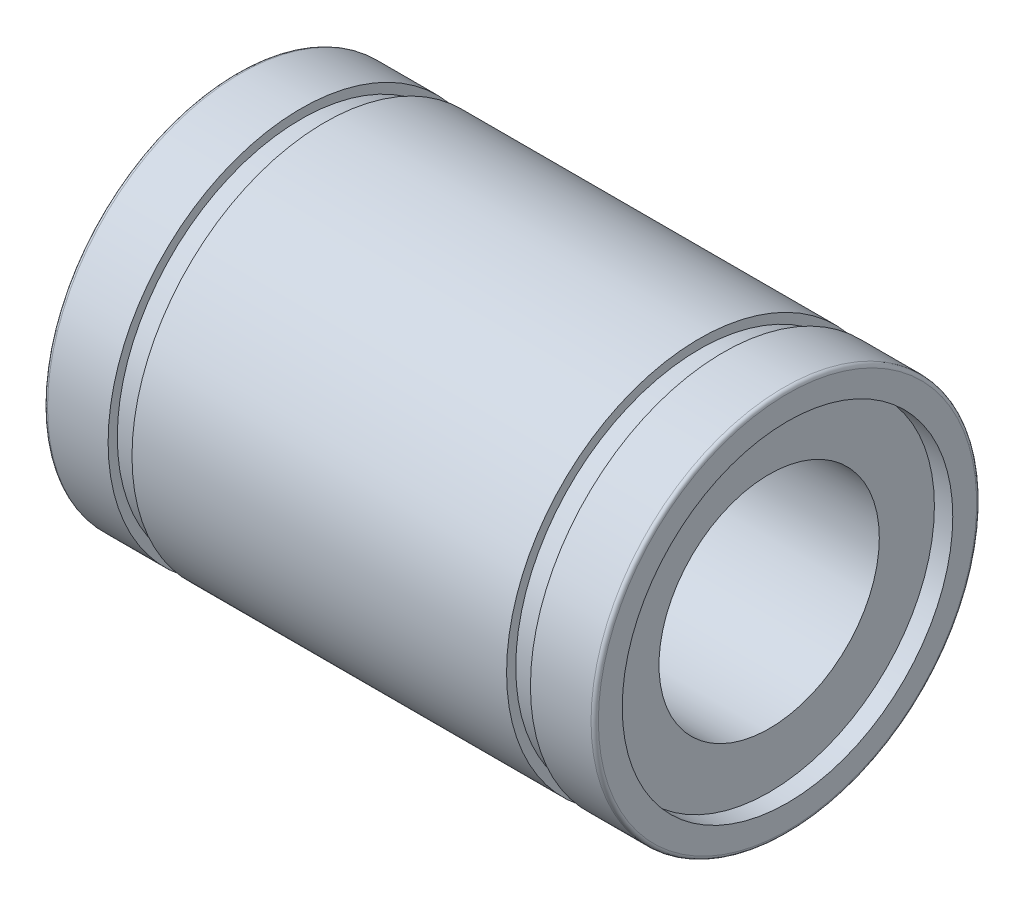
ISO-10303-21;
HEADER;
FILE_DESCRIPTION(('STEP AP214'),'2;1');
FILE_NAME('part.step','',(''),(''),'','','');
FILE_SCHEMA(('AUTOMOTIVE_DESIGN { 1 0 10303 214 1 1 1 1 }'));
ENDSEC;
DATA;
#1=APPLICATION_CONTEXT('core data for automotive mechanical design processes');
#2=APPLICATION_PROTOCOL_DEFINITION('international standard','automotive_design',2000,#1);
#3=PRODUCT_CONTEXT('',#1,'mechanical');
#4=PRODUCT('Part','Part','',(#3));
#5=PRODUCT_RELATED_PRODUCT_CATEGORY('part','',(#4));
#6=PRODUCT_DEFINITION_FORMATION('','',#4);
#7=PRODUCT_DEFINITION_CONTEXT('part definition',#1,'design');
#8=PRODUCT_DEFINITION('design','',#6,#7);
#9=PRODUCT_DEFINITION_SHAPE('','',#8);
#10=(LENGTH_UNIT() NAMED_UNIT(*) SI_UNIT(.MILLI.,.METRE.));
#11=(NAMED_UNIT(*) PLANE_ANGLE_UNIT() SI_UNIT($,.RADIAN.));
#12=(NAMED_UNIT(*) SI_UNIT($,.STERADIAN.) SOLID_ANGLE_UNIT());
#13=UNCERTAINTY_MEASURE_WITH_UNIT(LENGTH_MEASURE(1.E-05),#10,'distance_accuracy_value','');
#14=(GEOMETRIC_REPRESENTATION_CONTEXT(3) GLOBAL_UNCERTAINTY_ASSIGNED_CONTEXT((#13)) GLOBAL_UNIT_ASSIGNED_CONTEXT((#10,
#11,#12)) REPRESENTATION_CONTEXT('',''));
#15=CARTESIAN_POINT('',(0.,0.,0.));
#16=DIRECTION('',(0.,0.,1.));
#17=DIRECTION('',(1.,0.,0.));
#18=AXIS2_PLACEMENT_3D('',#15,#16,#17);
#19=CARTESIAN_POINT('',(-15.,0.,0.));
#20=DIRECTION('',(-1.,0.,0.));
#21=DIRECTION('',(0.,0.,1.));
#22=AXIS2_PLACEMENT_3D('',#19,#20,#21);
#23=CYLINDRICAL_SURFACE('',#22,9.);
#24=CARTESIAN_POINT('',(-14.,0.,0.));
#25=DIRECTION('',(-1.,0.,0.));
#26=DIRECTION('',(0.,0.,1.));
#27=AXIS2_PLACEMENT_3D('',#24,#25,#26);
#28=CIRCLE('',#27,9.);
#29=CARTESIAN_POINT('',(-14.,0.,-9.));
#30=VERTEX_POINT('',#29);
#31=EDGE_CURVE('E34',#30,#30,#28,.T.);
#32=ORIENTED_EDGE('',*,*,#31,.F.);
#33=EDGE_LOOP('',(#32));
#34=FACE_BOUND('',#33,.T.);
#35=CARTESIAN_POINT('',(-15.,0.,0.));
#36=DIRECTION('',(-1.,0.,0.));
#37=DIRECTION('',(0.,0.,1.));
#38=AXIS2_PLACEMENT_3D('',#35,#36,#37);
#39=CIRCLE('',#38,9.);
#40=CARTESIAN_POINT('',(-15.,0.,-9.));
#41=VERTEX_POINT('',#40);
#42=EDGE_CURVE('E11',#41,#41,#39,.T.);
#43=ORIENTED_EDGE('',*,*,#42,.T.);
#44=EDGE_LOOP('',(#43));
#45=FACE_BOUND('',#44,.T.);
#46=ADVANCED_FACE('F17',(#34,#45),#23,.F.);
#47=CARTESIAN_POINT('',(-14.,0.,0.));
#48=DIRECTION('',(-1.,0.,0.));
#49=DIRECTION('',(0.,0.707106781186548,0.707106781186548));
#50=AXIS2_PLACEMENT_3D('',#47,#48,#49);
#51=PLANE('',#50);
#52=CARTESIAN_POINT('',(-14.,0.,0.));
#53=DIRECTION('',(1.,0.,0.));
#54=DIRECTION('',(0.,0.,1.));
#55=AXIS2_PLACEMENT_3D('',#52,#53,#54);
#56=CIRCLE('',#55,6.);
#57=CARTESIAN_POINT('',(-14.,0.,-6.));
#58=VERTEX_POINT('',#57);
#59=EDGE_CURVE('E27',#58,#58,#56,.T.);
#60=ORIENTED_EDGE('',*,*,#59,.T.);
#61=EDGE_LOOP('',(#60));
#62=FACE_BOUND('',#61,.T.);
#63=ORIENTED_EDGE('',*,*,#31,.T.);
#64=EDGE_LOOP('',(#63));
#65=FACE_BOUND('',#64,.T.);
#66=ADVANCED_FACE('F137',(#62,#65),#51,.T.);
#67=CARTESIAN_POINT('',(-14.8,0.,0.));
#68=DIRECTION('',(1.,0.,0.));
#69=DIRECTION('',(0.,0.707106781186548,0.707106781186548));
#70=AXIS2_PLACEMENT_3D('',#67,#68,#69);
#71=TOROIDAL_SURFACE('',#70,10.3,0.2);
#72=CARTESIAN_POINT('',(-15.,0.,0.));
#73=DIRECTION('',(-1.,0.,0.));
#74=DIRECTION('',(0.,0.,-1.));
#75=AXIS2_PLACEMENT_3D('',#72,#73,#74);
#76=CIRCLE('',#75,10.3);
#77=CARTESIAN_POINT('',(-15.,0.,10.3));
#78=VERTEX_POINT('',#77);
#79=EDGE_CURVE('E204',#78,#78,#76,.T.);
#80=ORIENTED_EDGE('',*,*,#79,.F.);
#81=EDGE_LOOP('',(#80));
#82=FACE_BOUND('',#81,.T.);
#83=CARTESIAN_POINT('',(-14.8,0.,0.));
#84=DIRECTION('',(1.,0.,0.));
#85=DIRECTION('',(0.,0.,-1.));
#86=AXIS2_PLACEMENT_3D('',#83,#84,#85);
#87=CIRCLE('',#86,10.5);
#88=CARTESIAN_POINT('',(-14.8,0.,10.5));
#89=VERTEX_POINT('',#88);
#90=EDGE_CURVE('E208',#89,#89,#87,.T.);
#91=ORIENTED_EDGE('',*,*,#90,.F.);
#92=EDGE_LOOP('',(#91));
#93=FACE_BOUND('',#92,.T.);
#94=ADVANCED_FACE('F142',(#82,#93),#71,.T.);
#95=CARTESIAN_POINT('',(-13.25,0.,0.));
#96=DIRECTION('',(-1.,0.,0.));
#97=DIRECTION('',(0.,0.,1.));
#98=AXIS2_PLACEMENT_3D('',#95,#96,#97);
#99=CYLINDRICAL_SURFACE('',#98,10.5);
#100=CARTESIAN_POINT('',(-11.5,0.,0.));
#101=DIRECTION('',(-1.,0.,0.));
#102=DIRECTION('',(0.,0.,1.));
#103=AXIS2_PLACEMENT_3D('',#100,#101,#102);
#104=CIRCLE('',#103,10.5);
#105=CARTESIAN_POINT('',(-11.5,0.,10.5));
#106=VERTEX_POINT('',#105);
#107=EDGE_CURVE('E205',#106,#106,#104,.T.);
#108=ORIENTED_EDGE('',*,*,#107,.T.);
#109=EDGE_LOOP('',(#108));
#110=FACE_BOUND('',#109,.T.);
#111=ORIENTED_EDGE('',*,*,#90,.T.);
#112=EDGE_LOOP('',(#111));
#113=FACE_BOUND('',#112,.T.);
#114=ADVANCED_FACE('F149',(#110,#113),#99,.T.);
#115=CARTESIAN_POINT('',(-15.,0.,8.25));
#116=DIRECTION('',(-1.,0.,0.));
#117=DIRECTION('',(0.,0.707106781186548,0.707106781186548));
#118=AXIS2_PLACEMENT_3D('',#115,#116,#117);
#119=PLANE('',#118);
#120=ORIENTED_EDGE('',*,*,#42,.F.);
#121=EDGE_LOOP('',(#120));
#122=FACE_BOUND('',#121,.T.);
#123=ORIENTED_EDGE('',*,*,#79,.T.);
#124=EDGE_LOOP('',(#123));
#125=FACE_BOUND('',#124,.T.);
#126=ADVANCED_FACE('F153',(#122,#125),#119,.T.);
#127=CARTESIAN_POINT('',(-11.5,0.,10.25));
#128=DIRECTION('',(1.,0.,0.));
#129=DIRECTION('',(0.,0.707106781186548,0.707106781186548));
#130=AXIS2_PLACEMENT_3D('',#127,#128,#129);
#131=PLANE('',#130);
#132=CARTESIAN_POINT('',(-11.5,0.,0.));
#133=DIRECTION('',(-1.,0.,0.));
#134=DIRECTION('',(0.,0.,1.));
#135=AXIS2_PLACEMENT_3D('',#132,#133,#134);
#136=CIRCLE('',#135,10.);
#137=CARTESIAN_POINT('',(-11.5,0.,10.));
#138=VERTEX_POINT('',#137);
#139=EDGE_CURVE('E199',#138,#138,#136,.T.);
#140=ORIENTED_EDGE('',*,*,#139,.T.);
#141=EDGE_LOOP('',(#140));
#142=FACE_BOUND('',#141,.T.);
#143=ORIENTED_EDGE('',*,*,#107,.F.);
#144=EDGE_LOOP('',(#143));
#145=FACE_BOUND('',#144,.T.);
#146=ADVANCED_FACE('F157',(#142,#145),#131,.T.);
#147=CARTESIAN_POINT('',(-10.85,0.,0.));
#148=DIRECTION('',(-1.,0.,0.));
#149=DIRECTION('',(0.,0.,1.));
#150=AXIS2_PLACEMENT_3D('',#147,#148,#149);
#151=CYLINDRICAL_SURFACE('',#150,10.);
#152=CARTESIAN_POINT('',(-10.2,0.,0.));
#153=DIRECTION('',(-1.,0.,0.));
#154=DIRECTION('',(0.,0.,1.));
#155=AXIS2_PLACEMENT_3D('',#152,#153,#154);
#156=CIRCLE('',#155,10.);
#157=CARTESIAN_POINT('',(-10.2,0.,10.));
#158=VERTEX_POINT('',#157);
#159=EDGE_CURVE('E196',#158,#158,#156,.T.);
#160=ORIENTED_EDGE('',*,*,#159,.T.);
#161=EDGE_LOOP('',(#160));
#162=FACE_BOUND('',#161,.T.);
#163=ORIENTED_EDGE('',*,*,#139,.F.);
#164=EDGE_LOOP('',(#163));
#165=FACE_BOUND('',#164,.T.);
#166=ADVANCED_FACE('F161',(#162,#165),#151,.T.);
#167=CARTESIAN_POINT('',(-10.2,0.,10.25));
#168=DIRECTION('',(-1.,0.,0.));
#169=DIRECTION('',(0.,0.707106781186548,0.707106781186548));
#170=AXIS2_PLACEMENT_3D('',#167,#168,#169);
#171=PLANE('',#170);
#172=CARTESIAN_POINT('',(-10.2,0.,0.));
#173=DIRECTION('',(-1.,0.,0.));
#174=DIRECTION('',(0.,0.,1.));
#175=AXIS2_PLACEMENT_3D('',#172,#173,#174);
#176=CIRCLE('',#175,10.5);
#177=CARTESIAN_POINT('',(-10.2,0.,10.5));
#178=VERTEX_POINT('',#177);
#179=EDGE_CURVE('E195',#178,#178,#176,.T.);
#180=ORIENTED_EDGE('',*,*,#179,.T.);
#181=EDGE_LOOP('',(#180));
#182=FACE_BOUND('',#181,.T.);
#183=ORIENTED_EDGE('',*,*,#159,.F.);
#184=EDGE_LOOP('',(#183));
#185=FACE_BOUND('',#184,.T.);
#186=ADVANCED_FACE('F165',(#182,#185),#171,.T.);
#187=CARTESIAN_POINT('',(15.,0.,0.));
#188=DIRECTION('',(-1.,0.,0.));
#189=DIRECTION('',(0.,0.,1.));
#190=AXIS2_PLACEMENT_3D('',#187,#188,#189);
#191=CYLINDRICAL_SURFACE('',#190,9.);
#192=CARTESIAN_POINT('',(14.,0.,0.));
#193=DIRECTION('',(-1.,0.,0.));
#194=DIRECTION('',(0.,0.,1.));
#195=AXIS2_PLACEMENT_3D('',#192,#193,#194);
#196=CIRCLE('',#195,9.);
#197=CARTESIAN_POINT('',(14.,0.,-9.));
#198=VERTEX_POINT('',#197);
#199=EDGE_CURVE('E102',#198,#198,#196,.T.);
#200=ORIENTED_EDGE('',*,*,#199,.T.);
#201=EDGE_LOOP('',(#200));
#202=FACE_BOUND('',#201,.T.);
#203=CARTESIAN_POINT('',(15.,0.,0.));
#204=DIRECTION('',(-1.,0.,0.));
#205=DIRECTION('',(0.,0.,1.));
#206=AXIS2_PLACEMENT_3D('',#203,#204,#205);
#207=CIRCLE('',#206,9.);
#208=CARTESIAN_POINT('',(15.,0.,-9.));
#209=VERTEX_POINT('',#208);
#210=EDGE_CURVE('E97',#209,#209,#207,.T.);
#211=ORIENTED_EDGE('',*,*,#210,.F.);
#212=EDGE_LOOP('',(#211));
#213=FACE_BOUND('',#212,.T.);
#214=ADVANCED_FACE('F133',(#202,#213),#191,.F.);
#215=CARTESIAN_POINT('',(14.,0.,0.));
#216=DIRECTION('',(1.,0.,0.));
#217=DIRECTION('',(0.,0.707106781186548,0.707106781186548));
#218=AXIS2_PLACEMENT_3D('',#215,#216,#217);
#219=PLANE('',#218);
#220=CARTESIAN_POINT('',(14.,0.,0.));
#221=DIRECTION('',(1.,0.,0.));
#222=DIRECTION('',(0.,0.,1.));
#223=AXIS2_PLACEMENT_3D('',#220,#221,#222);
#224=CIRCLE('',#223,6.);
#225=CARTESIAN_POINT('',(14.,0.,-6.));
#226=VERTEX_POINT('',#225);
#227=EDGE_CURVE('E90',#226,#226,#224,.T.);
#228=ORIENTED_EDGE('',*,*,#227,.F.);
#229=EDGE_LOOP('',(#228));
#230=FACE_BOUND('',#229,.T.);
#231=ORIENTED_EDGE('',*,*,#199,.F.);
#232=EDGE_LOOP('',(#231));
#233=FACE_BOUND('',#232,.T.);
#234=ADVANCED_FACE('F126',(#230,#233),#219,.T.);
#235=CARTESIAN_POINT('',(14.8,0.,0.));
#236=DIRECTION('',(-1.,0.,0.));
#237=DIRECTION('',(0.,0.707106781186548,0.707106781186548));
#238=AXIS2_PLACEMENT_3D('',#235,#236,#237);
#239=TOROIDAL_SURFACE('',#238,10.3,0.2);
#240=CARTESIAN_POINT('',(15.,0.,0.));
#241=DIRECTION('',(-1.,0.,0.));
#242=DIRECTION('',(0.,0.,-1.));
#243=AXIS2_PLACEMENT_3D('',#240,#241,#242);
#244=CIRCLE('',#243,10.3);
#245=CARTESIAN_POINT('',(15.,0.,10.3));
#246=VERTEX_POINT('',#245);
#247=EDGE_CURVE('E99',#246,#246,#244,.T.);
#248=ORIENTED_EDGE('',*,*,#247,.T.);
#249=EDGE_LOOP('',(#248));
#250=FACE_BOUND('',#249,.T.);
#251=CARTESIAN_POINT('',(14.8,0.,0.));
#252=DIRECTION('',(1.,0.,0.));
#253=DIRECTION('',(0.,0.,-1.));
#254=AXIS2_PLACEMENT_3D('',#251,#252,#253);
#255=CIRCLE('',#254,10.5);
#256=CARTESIAN_POINT('',(14.8,0.,10.5));
#257=VERTEX_POINT('',#256);
#258=EDGE_CURVE('E103',#257,#257,#255,.T.);
#259=ORIENTED_EDGE('',*,*,#258,.T.);
#260=EDGE_LOOP('',(#259));
#261=FACE_BOUND('',#260,.T.);
#262=ADVANCED_FACE('F122',(#250,#261),#239,.T.);
#263=CARTESIAN_POINT('',(13.25,0.,0.));
#264=DIRECTION('',(-1.,0.,0.));
#265=DIRECTION('',(0.,0.,1.));
#266=AXIS2_PLACEMENT_3D('',#263,#264,#265);
#267=CYLINDRICAL_SURFACE('',#266,10.5);
#268=CARTESIAN_POINT('',(11.5,0.,0.));
#269=DIRECTION('',(-1.,0.,0.));
#270=DIRECTION('',(0.,0.,1.));
#271=AXIS2_PLACEMENT_3D('',#268,#269,#270);
#272=CIRCLE('',#271,10.5);
#273=CARTESIAN_POINT('',(11.5,0.,10.5));
#274=VERTEX_POINT('',#273);
#275=EDGE_CURVE('E106',#274,#274,#272,.T.);
#276=ORIENTED_EDGE('',*,*,#275,.F.);
#277=EDGE_LOOP('',(#276));
#278=FACE_BOUND('',#277,.T.);
#279=ORIENTED_EDGE('',*,*,#258,.F.);
#280=EDGE_LOOP('',(#279));
#281=FACE_BOUND('',#280,.T.);
#282=ADVANCED_FACE('F119',(#278,#281),#267,.T.);
#283=CARTESIAN_POINT('',(15.,0.,8.25));
#284=DIRECTION('',(1.,0.,0.));
#285=DIRECTION('',(0.,0.707106781186548,0.707106781186548));
#286=AXIS2_PLACEMENT_3D('',#283,#284,#285);
#287=PLANE('',#286);
#288=ORIENTED_EDGE('',*,*,#210,.T.);
#289=EDGE_LOOP('',(#288));
#290=FACE_BOUND('',#289,.T.);
#291=ORIENTED_EDGE('',*,*,#247,.F.);
#292=EDGE_LOOP('',(#291));
#293=FACE_BOUND('',#292,.T.);
#294=ADVANCED_FACE('F116',(#290,#293),#287,.T.);
#295=CARTESIAN_POINT('',(11.5,0.,10.25));
#296=DIRECTION('',(-1.,0.,0.));
#297=DIRECTION('',(0.,0.707106781186548,0.707106781186548));
#298=AXIS2_PLACEMENT_3D('',#295,#296,#297);
#299=PLANE('',#298);
#300=CARTESIAN_POINT('',(11.5,0.,0.));
#301=DIRECTION('',(-1.,0.,0.));
#302=DIRECTION('',(0.,0.,1.));
#303=AXIS2_PLACEMENT_3D('',#300,#301,#302);
#304=CIRCLE('',#303,10.);
#305=CARTESIAN_POINT('',(11.5,0.,10.));
#306=VERTEX_POINT('',#305);
#307=EDGE_CURVE('E91',#306,#306,#304,.T.);
#308=ORIENTED_EDGE('',*,*,#307,.F.);
#309=EDGE_LOOP('',(#308));
#310=FACE_BOUND('',#309,.T.);
#311=ORIENTED_EDGE('',*,*,#275,.T.);
#312=EDGE_LOOP('',(#311));
#313=FACE_BOUND('',#312,.T.);
#314=ADVANCED_FACE('F113',(#310,#313),#299,.T.);
#315=CARTESIAN_POINT('',(10.85,0.,0.));
#316=DIRECTION('',(-1.,0.,0.));
#317=DIRECTION('',(0.,0.,1.));
#318=AXIS2_PLACEMENT_3D('',#315,#316,#317);
#319=CYLINDRICAL_SURFACE('',#318,10.);
#320=CARTESIAN_POINT('',(10.2,0.,0.));
#321=DIRECTION('',(-1.,0.,0.));
#322=DIRECTION('',(0.,0.,1.));
#323=AXIS2_PLACEMENT_3D('',#320,#321,#322);
#324=CIRCLE('',#323,10.);
#325=CARTESIAN_POINT('',(10.2,0.,10.));
#326=VERTEX_POINT('',#325);
#327=EDGE_CURVE('E83',#326,#326,#324,.T.);
#328=ORIENTED_EDGE('',*,*,#327,.F.);
#329=EDGE_LOOP('',(#328));
#330=FACE_BOUND('',#329,.T.);
#331=ORIENTED_EDGE('',*,*,#307,.T.);
#332=EDGE_LOOP('',(#331));
#333=FACE_BOUND('',#332,.T.);
#334=ADVANCED_FACE('F111',(#330,#333),#319,.T.);
#335=CARTESIAN_POINT('',(10.2,0.,10.25));
#336=DIRECTION('',(1.,0.,0.));
#337=DIRECTION('',(0.,0.707106781186548,0.707106781186548));
#338=AXIS2_PLACEMENT_3D('',#335,#336,#337);
#339=PLANE('',#338);
#340=CARTESIAN_POINT('',(10.2,0.,0.));
#341=DIRECTION('',(-1.,0.,0.));
#342=DIRECTION('',(0.,0.,1.));
#343=AXIS2_PLACEMENT_3D('',#340,#341,#342);
#344=CIRCLE('',#343,10.5);
#345=CARTESIAN_POINT('',(10.2,0.,10.5));
#346=VERTEX_POINT('',#345);
#347=EDGE_CURVE('E21',#346,#346,#344,.T.);
#348=ORIENTED_EDGE('',*,*,#347,.F.);
#349=EDGE_LOOP('',(#348));
#350=FACE_BOUND('',#349,.T.);
#351=ORIENTED_EDGE('',*,*,#327,.T.);
#352=EDGE_LOOP('',(#351));
#353=FACE_BOUND('',#352,.T.);
#354=ADVANCED_FACE('F87',(#350,#353),#339,.T.);
#355=CARTESIAN_POINT('',(5.1,0.,0.));
#356=DIRECTION('',(-1.,0.,0.));
#357=DIRECTION('',(0.,0.,1.));
#358=AXIS2_PLACEMENT_3D('',#355,#356,#357);
#359=CYLINDRICAL_SURFACE('',#358,10.5);
#360=ORIENTED_EDGE('',*,*,#179,.F.);
#361=EDGE_LOOP('',(#360));
#362=FACE_BOUND('',#361,.T.);
#363=ORIENTED_EDGE('',*,*,#347,.T.);
#364=EDGE_LOOP('',(#363));
#365=FACE_BOUND('',#364,.T.);
#366=ADVANCED_FACE('F187',(#362,#365),#359,.T.);
#367=CARTESIAN_POINT('',(7.5,0.,0.));
#368=DIRECTION('',(1.,0.,0.));
#369=DIRECTION('',(0.,0.,1.));
#370=AXIS2_PLACEMENT_3D('',#367,#368,#369);
#371=CYLINDRICAL_SURFACE('',#370,6.);
#372=ORIENTED_EDGE('',*,*,#59,.F.);
#373=EDGE_LOOP('',(#372));
#374=FACE_BOUND('',#373,.T.);
#375=ORIENTED_EDGE('',*,*,#227,.T.);
#376=EDGE_LOOP('',(#375));
#377=FACE_BOUND('',#376,.T.);
#378=ADVANCED_FACE('F19',(#374,#377),#371,.F.);
#379=CLOSED_SHELL('',(#46,#66,#94,#114,#126,#146,#166,#186,#214,#234,#262,#282,#294,#314,#334,
#354,#366,#378));
#380=MANIFOLD_SOLID_BREP('B1',#379);
#381=ADVANCED_BREP_SHAPE_REPRESENTATION('',(#18,#380),#14);
#382=SHAPE_DEFINITION_REPRESENTATION(#9,#381);
ENDSEC;
END-ISO-10303-21;
